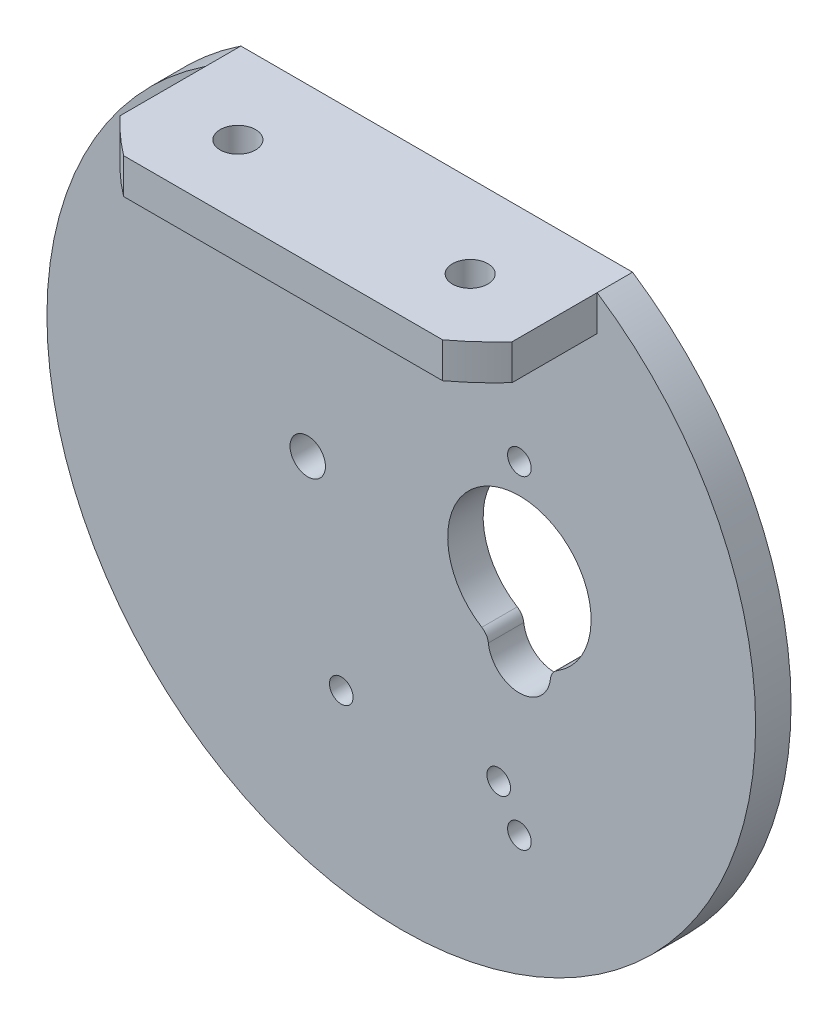
ISO-10303-21;
HEADER;
FILE_DESCRIPTION(('STEP AP214'),'2;1');
FILE_NAME('part.step','',(''),(''),'','','');
FILE_SCHEMA(('AUTOMOTIVE_DESIGN { 1 0 10303 214 1 1 1 1 }'));
ENDSEC;
DATA;
#1=APPLICATION_CONTEXT('core data for automotive mechanical design processes');
#2=APPLICATION_PROTOCOL_DEFINITION('international standard','automotive_design',2000,#1);
#3=PRODUCT_CONTEXT('',#1,'mechanical');
#4=PRODUCT('Part','Part','',(#3));
#5=PRODUCT_RELATED_PRODUCT_CATEGORY('part','',(#4));
#6=PRODUCT_DEFINITION_FORMATION('','',#4);
#7=PRODUCT_DEFINITION_CONTEXT('part definition',#1,'design');
#8=PRODUCT_DEFINITION('design','',#6,#7);
#9=PRODUCT_DEFINITION_SHAPE('','',#8);
#10=(LENGTH_UNIT() NAMED_UNIT(*) SI_UNIT(.MILLI.,.METRE.));
#11=(NAMED_UNIT(*) PLANE_ANGLE_UNIT() SI_UNIT($,.RADIAN.));
#12=(NAMED_UNIT(*) SI_UNIT($,.STERADIAN.) SOLID_ANGLE_UNIT());
#13=UNCERTAINTY_MEASURE_WITH_UNIT(LENGTH_MEASURE(1.E-05),#10,'distance_accuracy_value','');
#14=(GEOMETRIC_REPRESENTATION_CONTEXT(3) GLOBAL_UNCERTAINTY_ASSIGNED_CONTEXT((#13)) GLOBAL_UNIT_ASSIGNED_CONTEXT((#10,
#11,#12)) REPRESENTATION_CONTEXT('',''));
#15=CARTESIAN_POINT('',(0.,0.,0.));
#16=DIRECTION('',(0.,0.,1.));
#17=DIRECTION('',(1.,0.,0.));
#18=AXIS2_PLACEMENT_3D('',#15,#16,#17);
#19=CARTESIAN_POINT('',(0.,0.,3.));
#20=DIRECTION('',(0.,0.,1.));
#21=DIRECTION('',(1.,0.,0.));
#22=AXIS2_PLACEMENT_3D('',#19,#20,#21);
#23=PLANE('',#22);
#24=CARTESIAN_POINT('',(-5.08,-15.,3.));
#25=DIRECTION('',(0.,0.,-1.));
#26=DIRECTION('',(-1.,0.,0.));
#27=AXIS2_PLACEMENT_3D('',#24,#25,#26);
#28=CIRCLE('',#27,1.);
#29=CARTESIAN_POINT('',(-6.08,-15.,3.));
#30=VERTEX_POINT('',#29);
#31=EDGE_CURVE('E486',#30,#30,#28,.T.);
#32=ORIENTED_EDGE('',*,*,#31,.T.);
#33=EDGE_LOOP('',(#32));
#34=FACE_BOUND('',#33,.T.);
#35=CARTESIAN_POINT('',(8.24999999999999,-15.,3.));
#36=DIRECTION('',(0.,0.,-1.));
#37=DIRECTION('',(-1.,0.,0.));
#38=AXIS2_PLACEMENT_3D('',#35,#36,#37);
#39=CIRCLE('',#38,1.);
#40=CARTESIAN_POINT('',(7.25,-15.,3.));
#41=VERTEX_POINT('',#40);
#42=EDGE_CURVE('E491',#41,#41,#39,.T.);
#43=ORIENTED_EDGE('',*,*,#42,.T.);
#44=EDGE_LOOP('',(#43));
#45=FACE_BOUND('',#44,.T.);
#46=CARTESIAN_POINT('',(-7.92,0.750000000000004,3.));
#47=DIRECTION('',(0.,0.,1.));
#48=DIRECTION('',(1.,0.,0.));
#49=AXIS2_PLACEMENT_3D('',#46,#47,#48);
#50=CIRCLE('',#49,1.5);
#51=CARTESIAN_POINT('',(-6.42,0.750000000000004,3.));
#52=VERTEX_POINT('',#51);
#53=EDGE_CURVE('E507',#52,#52,#50,.T.);
#54=ORIENTED_EDGE('',*,*,#53,.F.);
#55=EDGE_LOOP('',(#54));
#56=FACE_BOUND('',#55,.T.);
#57=CARTESIAN_POINT('',(10.,-18.0750000000001,3.));
#58=DIRECTION('',(0.,0.,1.));
#59=DIRECTION('',(1.,0.,0.));
#60=AXIS2_PLACEMENT_3D('',#57,#58,#59);
#61=CIRCLE('',#60,1.);
#62=CARTESIAN_POINT('',(11.,-18.0750000000001,3.));
#63=VERTEX_POINT('',#62);
#64=EDGE_CURVE('E178',#63,#63,#61,.T.);
#65=ORIENTED_EDGE('',*,*,#64,.F.);
#66=EDGE_LOOP('',(#65));
#67=FACE_BOUND('',#66,.T.);
#68=CARTESIAN_POINT('',(10.,9.32499999999992,3.));
#69=DIRECTION('',(0.,0.,1.));
#70=DIRECTION('',(1.,0.,0.));
#71=AXIS2_PLACEMENT_3D('',#68,#69,#70);
#72=CIRCLE('',#71,1.);
#73=CARTESIAN_POINT('',(11.,9.32499999999992,3.));
#74=VERTEX_POINT('',#73);
#75=EDGE_CURVE('E172',#74,#74,#72,.T.);
#76=ORIENTED_EDGE('',*,*,#75,.F.);
#77=EDGE_LOOP('',(#76));
#78=FACE_BOUND('',#77,.T.);
#79=DIRECTION('',(0.,-1.,0.));
#80=VECTOR('',#79,1.);
#81=CARTESIAN_POINT('',(-16.5831239517769,0.,3.));
#82=LINE('',#81,#80);
#83=CARTESIAN_POINT('',(-16.583123951777,25.,3.));
#84=VERTEX_POINT('',#83);
#85=CARTESIAN_POINT('',(-16.583123951777,22.,3.));
#86=VERTEX_POINT('',#85);
#87=EDGE_CURVE('E223',#84,#86,#82,.T.);
#88=ORIENTED_EDGE('',*,*,#87,.F.);
#89=CARTESIAN_POINT('',(0.,0.,3.));
#90=DIRECTION('',(0.,0.,1.));
#91=DIRECTION('',(1.,0.,0.));
#92=AXIS2_PLACEMENT_3D('',#89,#90,#91);
#93=CIRCLE('',#92,30.);
#94=CARTESIAN_POINT('',(16.583123951777,25.,3.));
#95=VERTEX_POINT('',#94);
#96=EDGE_CURVE('E256',#84,#95,#93,.T.);
#97=ORIENTED_EDGE('',*,*,#96,.T.);
#98=DIRECTION('',(0.,-1.,0.));
#99=VECTOR('',#98,1.);
#100=CARTESIAN_POINT('',(16.583123951777,0.,3.));
#101=LINE('',#100,#99);
#102=CARTESIAN_POINT('',(16.583123951777,22.,3.));
#103=VERTEX_POINT('',#102);
#104=EDGE_CURVE('E237',#95,#103,#101,.T.);
#105=ORIENTED_EDGE('',*,*,#104,.T.);
#106=DIRECTION('',(-1.,0.,0.));
#107=VECTOR('',#106,1.);
#108=CARTESIAN_POINT('',(0.,22.,3.));
#109=LINE('',#108,#107);
#110=EDGE_CURVE('E229',#103,#86,#109,.T.);
#111=ORIENTED_EDGE('',*,*,#110,.T.);
#112=EDGE_LOOP('',(#88,#97,#105,#111));
#113=FACE_BOUND('',#112,.T.);
#114=CARTESIAN_POINT('',(10.,0.750000000000004,3.));
#115=DIRECTION('',(0.,0.,1.));
#116=DIRECTION('',(1.,0.,0.));
#117=AXIS2_PLACEMENT_3D('',#114,#115,#116);
#118=CIRCLE('',#117,6.07);
#119=CARTESIAN_POINT('',(13.1827659390263,-4.41864595202399,3.));
#120=VERTEX_POINT('',#119);
#121=CARTESIAN_POINT('',(6.81723406097369,-4.41864595202399,3.));
#122=VERTEX_POINT('',#121);
#123=EDGE_CURVE('E165',#120,#122,#118,.T.);
#124=ORIENTED_EDGE('',*,*,#123,.F.);
#125=CARTESIAN_POINT('',(13.8014914428238,-5.42342391304348,3.));
#126=DIRECTION('',(0.,0.,1.));
#127=DIRECTION('',(1.,0.,0.));
#128=AXIS2_PLACEMENT_3D('',#125,#126,#127);
#129=CIRCLE('',#128,1.18);
#130=CARTESIAN_POINT('',(12.6287437558873,-5.29279901960784,3.));
#131=VERTEX_POINT('',#130);
#132=EDGE_CURVE('E168',#120,#131,#129,.T.);
#133=ORIENTED_EDGE('',*,*,#132,.T.);
#134=CARTESIAN_POINT('',(10.,-5.,3.));
#135=DIRECTION('',(0.,0.,1.));
#136=DIRECTION('',(1.,0.,0.));
#137=AXIS2_PLACEMENT_3D('',#134,#135,#136);
#138=CIRCLE('',#137,2.645);
#139=CARTESIAN_POINT('',(7.37125624411266,-5.29279901960784,3.));
#140=VERTEX_POINT('',#139);
#141=EDGE_CURVE('E156',#140,#131,#138,.T.);
#142=ORIENTED_EDGE('',*,*,#141,.F.);
#143=CARTESIAN_POINT('',(6.19850855717615,-5.42342391304348,3.));
#144=DIRECTION('',(0.,0.,1.));
#145=DIRECTION('',(1.,0.,0.));
#146=AXIS2_PLACEMENT_3D('',#143,#144,#145);
#147=CIRCLE('',#146,1.18);
#148=EDGE_CURVE('E132',#140,#122,#147,.T.);
#149=ORIENTED_EDGE('',*,*,#148,.T.);
#150=EDGE_LOOP('',(#124,#133,#142,#149));
#151=FACE_BOUND('',#150,.T.);
#152=ADVANCED_FACE('F42',(#34,#45,#56,#67,#78,#113,#151),#23,.T.);
#153=CARTESIAN_POINT('',(0.,0.,0.));
#154=DIRECTION('',(0.,0.,1.));
#155=DIRECTION('',(1.,0.,0.));
#156=AXIS2_PLACEMENT_3D('',#153,#154,#155);
#157=PLANE('',#156);
#158=CARTESIAN_POINT('',(-5.08,-15.,0.));
#159=DIRECTION('',(0.,0.,-1.));
#160=DIRECTION('',(-1.,0.,0.));
#161=AXIS2_PLACEMENT_3D('',#158,#159,#160);
#162=CIRCLE('',#161,1.);
#163=CARTESIAN_POINT('',(-6.08,-15.,0.));
#164=VERTEX_POINT('',#163);
#165=EDGE_CURVE('E489',#164,#164,#162,.T.);
#166=ORIENTED_EDGE('',*,*,#165,.F.);
#167=EDGE_LOOP('',(#166));
#168=FACE_BOUND('',#167,.T.);
#169=CARTESIAN_POINT('',(8.24999999999999,-15.,0.));
#170=DIRECTION('',(0.,0.,-1.));
#171=DIRECTION('',(-1.,0.,0.));
#172=AXIS2_PLACEMENT_3D('',#169,#170,#171);
#173=CIRCLE('',#172,1.);
#174=CARTESIAN_POINT('',(7.25,-15.,0.));
#175=VERTEX_POINT('',#174);
#176=EDGE_CURVE('E498',#175,#175,#173,.T.);
#177=ORIENTED_EDGE('',*,*,#176,.F.);
#178=EDGE_LOOP('',(#177));
#179=FACE_BOUND('',#178,.T.);
#180=CARTESIAN_POINT('',(-7.92,0.750000000000004,0.));
#181=DIRECTION('',(0.,0.,-1.));
#182=DIRECTION('',(-1.,0.,0.));
#183=AXIS2_PLACEMENT_3D('',#180,#181,#182);
#184=CIRCLE('',#183,1.5);
#185=CARTESIAN_POINT('',(-9.42,0.750000000000004,0.));
#186=VERTEX_POINT('',#185);
#187=EDGE_CURVE('E495',#186,#186,#184,.T.);
#188=ORIENTED_EDGE('',*,*,#187,.F.);
#189=EDGE_LOOP('',(#188));
#190=FACE_BOUND('',#189,.T.);
#191=DIRECTION('',(1.,0.,0.));
#192=VECTOR('',#191,1.);
#193=CARTESIAN_POINT('',(0.,25.,0.));
#194=LINE('',#193,#192);
#195=CARTESIAN_POINT('',(-16.583123951777,25.,0.));
#196=VERTEX_POINT('',#195);
#197=CARTESIAN_POINT('',(16.583123951777,25.,0.));
#198=VERTEX_POINT('',#197);
#199=EDGE_CURVE('E247',#196,#198,#194,.T.);
#200=ORIENTED_EDGE('',*,*,#199,.T.);
#201=CARTESIAN_POINT('',(0.,0.,0.));
#202=DIRECTION('',(0.,0.,1.));
#203=DIRECTION('',(1.,0.,0.));
#204=AXIS2_PLACEMENT_3D('',#201,#202,#203);
#205=CIRCLE('',#204,30.);
#206=EDGE_CURVE('E261',#196,#198,#205,.T.);
#207=ORIENTED_EDGE('',*,*,#206,.F.);
#208=EDGE_LOOP('',(#200,#207));
#209=FACE_BOUND('',#208,.T.);
#210=CARTESIAN_POINT('',(10.,9.32499999999992,0.));
#211=DIRECTION('',(0.,0.,1.));
#212=DIRECTION('',(1.,0.,0.));
#213=AXIS2_PLACEMENT_3D('',#210,#211,#212);
#214=CIRCLE('',#213,1.);
#215=CARTESIAN_POINT('',(11.,9.32499999999992,0.));
#216=VERTEX_POINT('',#215);
#217=EDGE_CURVE('E182',#216,#216,#214,.T.);
#218=ORIENTED_EDGE('',*,*,#217,.T.);
#219=EDGE_LOOP('',(#218));
#220=FACE_BOUND('',#219,.T.);
#221=CARTESIAN_POINT('',(10.,-18.0750000000001,0.));
#222=DIRECTION('',(0.,0.,1.));
#223=DIRECTION('',(1.,0.,0.));
#224=AXIS2_PLACEMENT_3D('',#221,#222,#223);
#225=CIRCLE('',#224,1.);
#226=CARTESIAN_POINT('',(11.,-18.0750000000001,0.));
#227=VERTEX_POINT('',#226);
#228=EDGE_CURVE('E173',#227,#227,#225,.T.);
#229=ORIENTED_EDGE('',*,*,#228,.T.);
#230=EDGE_LOOP('',(#229));
#231=FACE_BOUND('',#230,.T.);
#232=CARTESIAN_POINT('',(13.8014914428238,-5.42342391304348,0.));
#233=DIRECTION('',(0.,0.,-1.));
#234=DIRECTION('',(-1.,0.,0.));
#235=AXIS2_PLACEMENT_3D('',#232,#233,#234);
#236=CIRCLE('',#235,1.18);
#237=CARTESIAN_POINT('',(12.6287437558873,-5.29279901960784,0.));
#238=VERTEX_POINT('',#237);
#239=CARTESIAN_POINT('',(13.1827659390263,-4.41864595202399,0.));
#240=VERTEX_POINT('',#239);
#241=EDGE_CURVE('E66',#238,#240,#236,.T.);
#242=ORIENTED_EDGE('',*,*,#241,.T.);
#243=CARTESIAN_POINT('',(10.,0.750000000000004,0.));
#244=DIRECTION('',(0.,0.,-1.));
#245=DIRECTION('',(-1.,0.,0.));
#246=AXIS2_PLACEMENT_3D('',#243,#244,#245);
#247=CIRCLE('',#246,6.07);
#248=CARTESIAN_POINT('',(6.81723406097369,-4.41864595202399,0.));
#249=VERTEX_POINT('',#248);
#250=EDGE_CURVE('E146',#249,#240,#247,.T.);
#251=ORIENTED_EDGE('',*,*,#250,.F.);
#252=CARTESIAN_POINT('',(6.19850855717615,-5.42342391304348,0.));
#253=DIRECTION('',(0.,0.,-1.));
#254=DIRECTION('',(-1.,0.,0.));
#255=AXIS2_PLACEMENT_3D('',#252,#253,#254);
#256=CIRCLE('',#255,1.18);
#257=CARTESIAN_POINT('',(7.37125624411266,-5.29279901960784,0.));
#258=VERTEX_POINT('',#257);
#259=EDGE_CURVE('E129',#249,#258,#256,.T.);
#260=ORIENTED_EDGE('',*,*,#259,.T.);
#261=CARTESIAN_POINT('',(10.,-5.,0.));
#262=DIRECTION('',(0.,0.,-1.));
#263=DIRECTION('',(-1.,0.,0.));
#264=AXIS2_PLACEMENT_3D('',#261,#262,#263);
#265=CIRCLE('',#264,2.645);
#266=EDGE_CURVE('E139',#238,#258,#265,.T.);
#267=ORIENTED_EDGE('',*,*,#266,.F.);
#268=EDGE_LOOP('',(#242,#251,#260,#267));
#269=FACE_BOUND('',#268,.T.);
#270=ADVANCED_FACE('F144',(#168,#179,#190,#209,#220,#231,#269),#157,.F.);
#271=CARTESIAN_POINT('',(0.,25.,3.));
#272=DIRECTION('',(0.,1.,0.));
#273=DIRECTION('',(0.,0.,1.));
#274=AXIS2_PLACEMENT_3D('',#271,#272,#273);
#275=PLANE('',#274);
#276=CARTESIAN_POINT('',(-9.83312395177701,25.,7.));
#277=DIRECTION('',(0.,1.,0.));
#278=DIRECTION('',(0.,0.,1.));
#279=AXIS2_PLACEMENT_3D('',#276,#277,#278);
#280=CIRCLE('',#279,1.5);
#281=CARTESIAN_POINT('',(-9.83312395177701,25.,8.5));
#282=VERTEX_POINT('',#281);
#283=EDGE_CURVE('E200',#282,#282,#280,.T.);
#284=ORIENTED_EDGE('',*,*,#283,.F.);
#285=EDGE_LOOP('',(#284));
#286=FACE_BOUND('',#285,.T.);
#287=CARTESIAN_POINT('',(9.83312395177701,25.,7.));
#288=DIRECTION('',(0.,1.,0.));
#289=DIRECTION('',(0.,0.,1.));
#290=AXIS2_PLACEMENT_3D('',#287,#288,#289);
#291=CIRCLE('',#290,1.5);
#292=CARTESIAN_POINT('',(9.83312395177701,25.,8.5));
#293=VERTEX_POINT('',#292);
#294=EDGE_CURVE('E193',#293,#293,#291,.T.);
#295=ORIENTED_EDGE('',*,*,#294,.F.);
#296=EDGE_LOOP('',(#295));
#297=FACE_BOUND('',#296,.T.);
#298=CARTESIAN_POINT('',(-0.00187604822300506,25.,-5.));
#299=DIRECTION('',(0.,-1.,0.));
#300=DIRECTION('',(0.,0.,1.));
#301=AXIS2_PLACEMENT_3D('',#298,#299,#300);
#302=CIRCLE('',#301,22.5);
#303=CARTESIAN_POINT('',(-13.501876048223,25.,13.));
#304=VERTEX_POINT('',#303);
#305=CARTESIAN_POINT('',(-16.583123951777,25.,10.2089519021163));
#306=VERTEX_POINT('',#305);
#307=EDGE_CURVE('E205',#304,#306,#302,.T.);
#308=ORIENTED_EDGE('',*,*,#307,.F.);
#309=DIRECTION('',(1.,0.,0.));
#310=VECTOR('',#309,1.);
#311=CARTESIAN_POINT('',(0.,25.,13.));
#312=LINE('',#311,#310);
#313=CARTESIAN_POINT('',(13.498123951777,25.,13.));
#314=VERTEX_POINT('',#313);
#315=EDGE_CURVE('E224',#304,#314,#312,.T.);
#316=ORIENTED_EDGE('',*,*,#315,.T.);
#317=CARTESIAN_POINT('',(-0.00187604822300506,25.,-5.));
#318=DIRECTION('',(0.,-1.,0.));
#319=DIRECTION('',(0.,0.,1.));
#320=AXIS2_PLACEMENT_3D('',#317,#318,#319);
#321=CIRCLE('',#320,22.5);
#322=CARTESIAN_POINT('',(16.583123951777,25.,10.2048602426987));
#323=VERTEX_POINT('',#322);
#324=EDGE_CURVE('E204',#323,#314,#321,.T.);
#325=ORIENTED_EDGE('',*,*,#324,.F.);
#326=DIRECTION('',(0.,0.,-1.));
#327=VECTOR('',#326,1.);
#328=CARTESIAN_POINT('',(16.583123951777,25.,13.));
#329=LINE('',#328,#327);
#330=EDGE_CURVE('E251',#323,#95,#329,.T.);
#331=ORIENTED_EDGE('',*,*,#330,.T.);
#332=DIRECTION('',(0.,0.,-1.));
#333=VECTOR('',#332,1.);
#334=CARTESIAN_POINT('',(16.583123951777,25.,3.));
#335=LINE('',#334,#333);
#336=EDGE_CURVE('E260',#95,#198,#335,.T.);
#337=ORIENTED_EDGE('',*,*,#336,.T.);
#338=ORIENTED_EDGE('',*,*,#199,.F.);
#339=DIRECTION('',(0.,0.,-1.));
#340=VECTOR('',#339,1.);
#341=CARTESIAN_POINT('',(-16.583123951777,25.,3.));
#342=LINE('',#341,#340);
#343=EDGE_CURVE('E270',#84,#196,#342,.T.);
#344=ORIENTED_EDGE('',*,*,#343,.F.);
#345=DIRECTION('',(0.,0.,-1.));
#346=VECTOR('',#345,1.);
#347=CARTESIAN_POINT('',(-16.583123951777,25.,13.));
#348=LINE('',#347,#346);
#349=EDGE_CURVE('E233',#306,#84,#348,.T.);
#350=ORIENTED_EDGE('',*,*,#349,.F.);
#351=EDGE_LOOP('',(#308,#316,#325,#331,#337,#338,#344,#350));
#352=FACE_BOUND('',#351,.T.);
#353=ADVANCED_FACE('F44',(#286,#297,#352),#275,.T.);
#354=CARTESIAN_POINT('',(0.,0.,3.));
#355=DIRECTION('',(0.,0.,-1.));
#356=DIRECTION('',(-1.,0.,0.));
#357=AXIS2_PLACEMENT_3D('',#354,#355,#356);
#358=CYLINDRICAL_SURFACE('',#357,30.);
#359=ORIENTED_EDGE('',*,*,#206,.T.);
#360=ORIENTED_EDGE('',*,*,#336,.F.);
#361=ORIENTED_EDGE('',*,*,#96,.F.);
#362=ORIENTED_EDGE('',*,*,#343,.T.);
#363=EDGE_LOOP('',(#359,#360,#361,#362));
#364=FACE_BOUND('',#363,.T.);
#365=ADVANCED_FACE('F307',(#364),#358,.T.);
#366=CARTESIAN_POINT('',(-16.5831239517769,0.,13.));
#367=DIRECTION('',(1.,0.,0.));
#368=DIRECTION('',(0.,1.,0.));
#369=AXIS2_PLACEMENT_3D('',#366,#367,#368);
#370=PLANE('',#369);
#371=DIRECTION('',(0.,0.,-1.));
#372=VECTOR('',#371,1.);
#373=CARTESIAN_POINT('',(-16.583123951777,22.,13.));
#374=LINE('',#373,#372);
#375=CARTESIAN_POINT('',(-16.583123951777,22.,10.2089519021163));
#376=VERTEX_POINT('',#375);
#377=EDGE_CURVE('E244',#376,#86,#374,.T.);
#378=ORIENTED_EDGE('',*,*,#377,.F.);
#379=DIRECTION('',(0.,1.,0.));
#380=VECTOR('',#379,1.);
#381=CARTESIAN_POINT('',(-16.583123951777,15.,10.2089519021163));
#382=LINE('',#381,#380);
#383=EDGE_CURVE('E208',#376,#306,#382,.T.);
#384=ORIENTED_EDGE('',*,*,#383,.T.);
#385=ORIENTED_EDGE('',*,*,#349,.T.);
#386=ORIENTED_EDGE('',*,*,#87,.T.);
#387=EDGE_LOOP('',(#378,#384,#385,#386));
#388=FACE_BOUND('',#387,.T.);
#389=ADVANCED_FACE('F291',(#388),#370,.F.);
#390=CARTESIAN_POINT('',(0.,22.,13.));
#391=DIRECTION('',(0.,-1.,0.));
#392=DIRECTION('',(0.,0.,-1.));
#393=AXIS2_PLACEMENT_3D('',#390,#391,#392);
#394=PLANE('',#393);
#395=CARTESIAN_POINT('',(-9.83312395177701,22.,7.));
#396=DIRECTION('',(0.,-1.,0.));
#397=DIRECTION('',(0.,0.,-1.));
#398=AXIS2_PLACEMENT_3D('',#395,#396,#397);
#399=CIRCLE('',#398,1.5);
#400=CARTESIAN_POINT('',(-9.83312395177701,22.,5.5));
#401=VERTEX_POINT('',#400);
#402=EDGE_CURVE('E189',#401,#401,#399,.T.);
#403=ORIENTED_EDGE('',*,*,#402,.F.);
#404=EDGE_LOOP('',(#403));
#405=FACE_BOUND('',#404,.T.);
#406=CARTESIAN_POINT('',(9.83312395177701,22.,7.));
#407=DIRECTION('',(0.,-1.,0.));
#408=DIRECTION('',(0.,0.,1.));
#409=AXIS2_PLACEMENT_3D('',#406,#407,#408);
#410=CIRCLE('',#409,1.5);
#411=CARTESIAN_POINT('',(9.83312395177701,22.,8.5));
#412=VERTEX_POINT('',#411);
#413=EDGE_CURVE('E177',#412,#412,#410,.T.);
#414=ORIENTED_EDGE('',*,*,#413,.F.);
#415=EDGE_LOOP('',(#414));
#416=FACE_BOUND('',#415,.T.);
#417=CARTESIAN_POINT('',(-0.00187604822300506,22.,-5.));
#418=DIRECTION('',(0.,-1.,0.));
#419=DIRECTION('',(0.,0.,-1.));
#420=AXIS2_PLACEMENT_3D('',#417,#418,#419);
#421=CIRCLE('',#420,22.5);
#422=CARTESIAN_POINT('',(-13.501876048223,22.,13.));
#423=VERTEX_POINT('',#422);
#424=EDGE_CURVE('E220',#376,#423,#421,.F.);
#425=ORIENTED_EDGE('',*,*,#424,.F.);
#426=ORIENTED_EDGE('',*,*,#377,.T.);
#427=ORIENTED_EDGE('',*,*,#110,.F.);
#428=DIRECTION('',(0.,0.,-1.));
#429=VECTOR('',#428,1.);
#430=CARTESIAN_POINT('',(16.583123951777,22.,13.));
#431=LINE('',#430,#429);
#432=CARTESIAN_POINT('',(16.583123951777,22.,10.2048602426987));
#433=VERTEX_POINT('',#432);
#434=EDGE_CURVE('E248',#433,#103,#431,.T.);
#435=ORIENTED_EDGE('',*,*,#434,.F.);
#436=CARTESIAN_POINT('',(-0.00187604822300506,22.,-5.));
#437=DIRECTION('',(0.,-1.,0.));
#438=DIRECTION('',(0.,0.,-1.));
#439=AXIS2_PLACEMENT_3D('',#436,#437,#438);
#440=CIRCLE('',#439,22.5);
#441=CARTESIAN_POINT('',(13.498123951777,22.,13.));
#442=VERTEX_POINT('',#441);
#443=EDGE_CURVE('E213',#442,#433,#440,.F.);
#444=ORIENTED_EDGE('',*,*,#443,.F.);
#445=DIRECTION('',(-1.,0.,0.));
#446=VECTOR('',#445,1.);
#447=CARTESIAN_POINT('',(0.,22.,13.));
#448=LINE('',#447,#446);
#449=EDGE_CURVE('E228',#442,#423,#448,.T.);
#450=ORIENTED_EDGE('',*,*,#449,.T.);
#451=EDGE_LOOP('',(#425,#426,#427,#435,#444,#450));
#452=FACE_BOUND('',#451,.T.);
#453=ADVANCED_FACE('F295',(#405,#416,#452),#394,.T.);
#454=CARTESIAN_POINT('',(16.583123951777,0.,13.));
#455=DIRECTION('',(1.,0.,0.));
#456=DIRECTION('',(0.,0.,-1.));
#457=AXIS2_PLACEMENT_3D('',#454,#455,#456);
#458=PLANE('',#457);
#459=DIRECTION('',(0.,1.,0.));
#460=VECTOR('',#459,1.);
#461=CARTESIAN_POINT('',(16.583123951777,15.,10.2048602426987));
#462=LINE('',#461,#460);
#463=EDGE_CURVE('E209',#433,#323,#462,.T.);
#464=ORIENTED_EDGE('',*,*,#463,.F.);
#465=ORIENTED_EDGE('',*,*,#434,.T.);
#466=ORIENTED_EDGE('',*,*,#104,.F.);
#467=ORIENTED_EDGE('',*,*,#330,.F.);
#468=EDGE_LOOP('',(#464,#465,#466,#467));
#469=FACE_BOUND('',#468,.T.);
#470=ADVANCED_FACE('F300',(#469),#458,.T.);
#471=CARTESIAN_POINT('',(0.,0.,13.));
#472=DIRECTION('',(0.,0.,-1.));
#473=DIRECTION('',(-1.,0.,0.));
#474=AXIS2_PLACEMENT_3D('',#471,#472,#473);
#475=PLANE('',#474);
#476=ORIENTED_EDGE('',*,*,#315,.F.);
#477=DIRECTION('',(0.,1.,0.));
#478=VECTOR('',#477,1.);
#479=CARTESIAN_POINT('',(-13.501876048223,15.,13.));
#480=LINE('',#479,#478);
#481=EDGE_CURVE('E11',#304,#423,#480,.F.);
#482=ORIENTED_EDGE('',*,*,#481,.T.);
#483=ORIENTED_EDGE('',*,*,#449,.F.);
#484=DIRECTION('',(0.,1.,0.));
#485=VECTOR('',#484,1.);
#486=CARTESIAN_POINT('',(13.498123951777,15.,13.));
#487=LINE('',#486,#485);
#488=EDGE_CURVE('E51',#442,#314,#487,.T.);
#489=ORIENTED_EDGE('',*,*,#488,.T.);
#490=EDGE_LOOP('',(#476,#482,#483,#489));
#491=FACE_BOUND('',#490,.T.);
#492=ADVANCED_FACE('F277',(#491),#475,.F.);
#493=CARTESIAN_POINT('',(-0.00187604822300506,15.,-5.));
#494=DIRECTION('',(0.,1.,0.));
#495=DIRECTION('',(0.,0.,1.));
#496=AXIS2_PLACEMENT_3D('',#493,#494,#495);
#497=CYLINDRICAL_SURFACE('',#496,22.5);
#498=ORIENTED_EDGE('',*,*,#443,.T.);
#499=ORIENTED_EDGE('',*,*,#463,.T.);
#500=ORIENTED_EDGE('',*,*,#324,.T.);
#501=ORIENTED_EDGE('',*,*,#488,.F.);
#502=EDGE_LOOP('',(#498,#499,#500,#501));
#503=FACE_BOUND('',#502,.T.);
#504=ADVANCED_FACE('F298',(#503),#497,.T.);
#505=CARTESIAN_POINT('',(-0.00187604822300506,15.,-5.));
#506=DIRECTION('',(0.,1.,0.));
#507=DIRECTION('',(0.,0.,1.));
#508=AXIS2_PLACEMENT_3D('',#505,#506,#507);
#509=CYLINDRICAL_SURFACE('',#508,22.5);
#510=ORIENTED_EDGE('',*,*,#424,.T.);
#511=ORIENTED_EDGE('',*,*,#481,.F.);
#512=ORIENTED_EDGE('',*,*,#307,.T.);
#513=ORIENTED_EDGE('',*,*,#383,.F.);
#514=EDGE_LOOP('',(#510,#511,#512,#513));
#515=FACE_BOUND('',#514,.T.);
#516=ADVANCED_FACE('F287',(#515),#509,.T.);
#517=CARTESIAN_POINT('',(9.83312395177701,32.,7.));
#518=DIRECTION('',(0.,-1.,0.));
#519=DIRECTION('',(0.,0.,-1.));
#520=AXIS2_PLACEMENT_3D('',#517,#518,#519);
#521=CYLINDRICAL_SURFACE('',#520,1.5);
#522=ORIENTED_EDGE('',*,*,#294,.T.);
#523=EDGE_LOOP('',(#522));
#524=FACE_BOUND('',#523,.T.);
#525=ORIENTED_EDGE('',*,*,#413,.T.);
#526=EDGE_LOOP('',(#525));
#527=FACE_BOUND('',#526,.T.);
#528=ADVANCED_FACE('F351',(#524,#527),#521,.F.);
#529=CARTESIAN_POINT('',(-9.83312395177701,32.,7.));
#530=DIRECTION('',(0.,-1.,0.));
#531=DIRECTION('',(0.,0.,-1.));
#532=AXIS2_PLACEMENT_3D('',#529,#530,#531);
#533=CYLINDRICAL_SURFACE('',#532,1.5);
#534=ORIENTED_EDGE('',*,*,#283,.T.);
#535=EDGE_LOOP('',(#534));
#536=FACE_BOUND('',#535,.T.);
#537=ORIENTED_EDGE('',*,*,#402,.T.);
#538=EDGE_LOOP('',(#537));
#539=FACE_BOUND('',#538,.T.);
#540=ADVANCED_FACE('F347',(#536,#539),#533,.F.);
#541=CARTESIAN_POINT('',(10.,9.32499999999992,0.));
#542=DIRECTION('',(0.,0.,1.));
#543=DIRECTION('',(1.,0.,0.));
#544=AXIS2_PLACEMENT_3D('',#541,#542,#543);
#545=CYLINDRICAL_SURFACE('',#544,1.);
#546=ORIENTED_EDGE('',*,*,#217,.F.);
#547=EDGE_LOOP('',(#546));
#548=FACE_BOUND('',#547,.T.);
#549=ORIENTED_EDGE('',*,*,#75,.T.);
#550=EDGE_LOOP('',(#549));
#551=FACE_BOUND('',#550,.T.);
#552=ADVANCED_FACE('F321',(#548,#551),#545,.F.);
#553=CARTESIAN_POINT('',(10.,-18.0750000000001,0.));
#554=DIRECTION('',(0.,0.,1.));
#555=DIRECTION('',(1.,0.,0.));
#556=AXIS2_PLACEMENT_3D('',#553,#554,#555);
#557=CYLINDRICAL_SURFACE('',#556,1.);
#558=ORIENTED_EDGE('',*,*,#228,.F.);
#559=EDGE_LOOP('',(#558));
#560=FACE_BOUND('',#559,.T.);
#561=ORIENTED_EDGE('',*,*,#64,.T.);
#562=EDGE_LOOP('',(#561));
#563=FACE_BOUND('',#562,.T.);
#564=ADVANCED_FACE('F317',(#560,#563),#557,.F.);
#565=CARTESIAN_POINT('',(13.8014914428238,-5.42342391304348,13.));
#566=DIRECTION('',(0.,0.,-1.));
#567=DIRECTION('',(-1.,0.,0.));
#568=AXIS2_PLACEMENT_3D('',#565,#566,#567);
#569=CYLINDRICAL_SURFACE('',#568,1.18);
#570=DIRECTION('',(0.,0.,-1.));
#571=VECTOR('',#570,1.);
#572=CARTESIAN_POINT('',(13.1827659390263,-4.41864595202399,13.));
#573=LINE('',#572,#571);
#574=EDGE_CURVE('E153',#120,#240,#573,.T.);
#575=ORIENTED_EDGE('',*,*,#574,.T.);
#576=ORIENTED_EDGE('',*,*,#241,.F.);
#577=DIRECTION('',(0.,0.,-1.));
#578=VECTOR('',#577,1.);
#579=CARTESIAN_POINT('',(12.6287437558873,-5.29279901960784,13.));
#580=LINE('',#579,#578);
#581=EDGE_CURVE('E136',#131,#238,#580,.T.);
#582=ORIENTED_EDGE('',*,*,#581,.F.);
#583=ORIENTED_EDGE('',*,*,#132,.F.);
#584=EDGE_LOOP('',(#575,#576,#582,#583));
#585=FACE_BOUND('',#584,.T.);
#586=ADVANCED_FACE('F320',(#585),#569,.T.);
#587=CARTESIAN_POINT('',(10.,0.750000000000004,13.));
#588=DIRECTION('',(0.,0.,-1.));
#589=DIRECTION('',(-1.,0.,0.));
#590=AXIS2_PLACEMENT_3D('',#587,#588,#589);
#591=CYLINDRICAL_SURFACE('',#590,6.07);
#592=ORIENTED_EDGE('',*,*,#123,.T.);
#593=DIRECTION('',(0.,0.,-1.));
#594=VECTOR('',#593,1.);
#595=CARTESIAN_POINT('',(6.81723406097369,-4.41864595202399,13.));
#596=LINE('',#595,#594);
#597=EDGE_CURVE('E135',#122,#249,#596,.T.);
#598=ORIENTED_EDGE('',*,*,#597,.T.);
#599=ORIENTED_EDGE('',*,*,#250,.T.);
#600=ORIENTED_EDGE('',*,*,#574,.F.);
#601=EDGE_LOOP('',(#592,#598,#599,#600));
#602=FACE_BOUND('',#601,.T.);
#603=ADVANCED_FACE('F335',(#602),#591,.F.);
#604=CARTESIAN_POINT('',(6.19850855717615,-5.42342391304348,13.));
#605=DIRECTION('',(0.,0.,-1.));
#606=DIRECTION('',(-1.,0.,0.));
#607=AXIS2_PLACEMENT_3D('',#604,#605,#606);
#608=CYLINDRICAL_SURFACE('',#607,1.18);
#609=DIRECTION('',(0.,0.,-1.));
#610=VECTOR('',#609,1.);
#611=CARTESIAN_POINT('',(7.37125624411266,-5.29279901960784,13.));
#612=LINE('',#611,#610);
#613=EDGE_CURVE('E58',#140,#258,#612,.T.);
#614=ORIENTED_EDGE('',*,*,#613,.T.);
#615=ORIENTED_EDGE('',*,*,#259,.F.);
#616=ORIENTED_EDGE('',*,*,#597,.F.);
#617=ORIENTED_EDGE('',*,*,#148,.F.);
#618=EDGE_LOOP('',(#614,#615,#616,#617));
#619=FACE_BOUND('',#618,.T.);
#620=ADVANCED_FACE('F126',(#619),#608,.T.);
#621=CARTESIAN_POINT('',(10.,-5.,13.));
#622=DIRECTION('',(0.,0.,-1.));
#623=DIRECTION('',(-1.,0.,0.));
#624=AXIS2_PLACEMENT_3D('',#621,#622,#623);
#625=CYLINDRICAL_SURFACE('',#624,2.645);
#626=ORIENTED_EDGE('',*,*,#141,.T.);
#627=ORIENTED_EDGE('',*,*,#581,.T.);
#628=ORIENTED_EDGE('',*,*,#266,.T.);
#629=ORIENTED_EDGE('',*,*,#613,.F.);
#630=EDGE_LOOP('',(#626,#627,#628,#629));
#631=FACE_BOUND('',#630,.T.);
#632=ADVANCED_FACE('F140',(#631),#625,.F.);
#633=CARTESIAN_POINT('',(-7.92,0.750000000000004,13.));
#634=DIRECTION('',(0.,0.,-1.));
#635=DIRECTION('',(-1.,0.,0.));
#636=AXIS2_PLACEMENT_3D('',#633,#634,#635);
#637=CYLINDRICAL_SURFACE('',#636,1.5);
#638=ORIENTED_EDGE('',*,*,#53,.T.);
#639=EDGE_LOOP('',(#638));
#640=FACE_BOUND('',#639,.T.);
#641=ORIENTED_EDGE('',*,*,#187,.T.);
#642=EDGE_LOOP('',(#641));
#643=FACE_BOUND('',#642,.T.);
#644=ADVANCED_FACE('F443',(#640,#643),#637,.F.);
#645=CARTESIAN_POINT('',(8.24999999999999,-15.,3.));
#646=DIRECTION('',(0.,0.,-1.));
#647=DIRECTION('',(-1.,0.,0.));
#648=AXIS2_PLACEMENT_3D('',#645,#646,#647);
#649=CYLINDRICAL_SURFACE('',#648,1.);
#650=ORIENTED_EDGE('',*,*,#42,.F.);
#651=EDGE_LOOP('',(#650));
#652=FACE_BOUND('',#651,.T.);
#653=ORIENTED_EDGE('',*,*,#176,.T.);
#654=EDGE_LOOP('',(#653));
#655=FACE_BOUND('',#654,.T.);
#656=ADVANCED_FACE('F450',(#652,#655),#649,.F.);
#657=CARTESIAN_POINT('',(-5.08,-15.,3.));
#658=DIRECTION('',(0.,0.,-1.));
#659=DIRECTION('',(-1.,0.,0.));
#660=AXIS2_PLACEMENT_3D('',#657,#658,#659);
#661=CYLINDRICAL_SURFACE('',#660,1.);
#662=ORIENTED_EDGE('',*,*,#31,.F.);
#663=EDGE_LOOP('',(#662));
#664=FACE_BOUND('',#663,.T.);
#665=ORIENTED_EDGE('',*,*,#165,.T.);
#666=EDGE_LOOP('',(#665));
#667=FACE_BOUND('',#666,.T.);
#668=ADVANCED_FACE('F469',(#664,#667),#661,.F.);
#669=CLOSED_SHELL('',(#152,#270,#353,#365,#389,#453,#470,#492,#504,#516,#528,#540,#552,#564,
#586,#603,#620,#632,#644,#656,#668));
#670=MANIFOLD_SOLID_BREP('B2',#669);
#671=ADVANCED_BREP_SHAPE_REPRESENTATION('',(#18,#670),#14);
#672=SHAPE_DEFINITION_REPRESENTATION(#9,#671);
ENDSEC;
END-ISO-10303-21;
